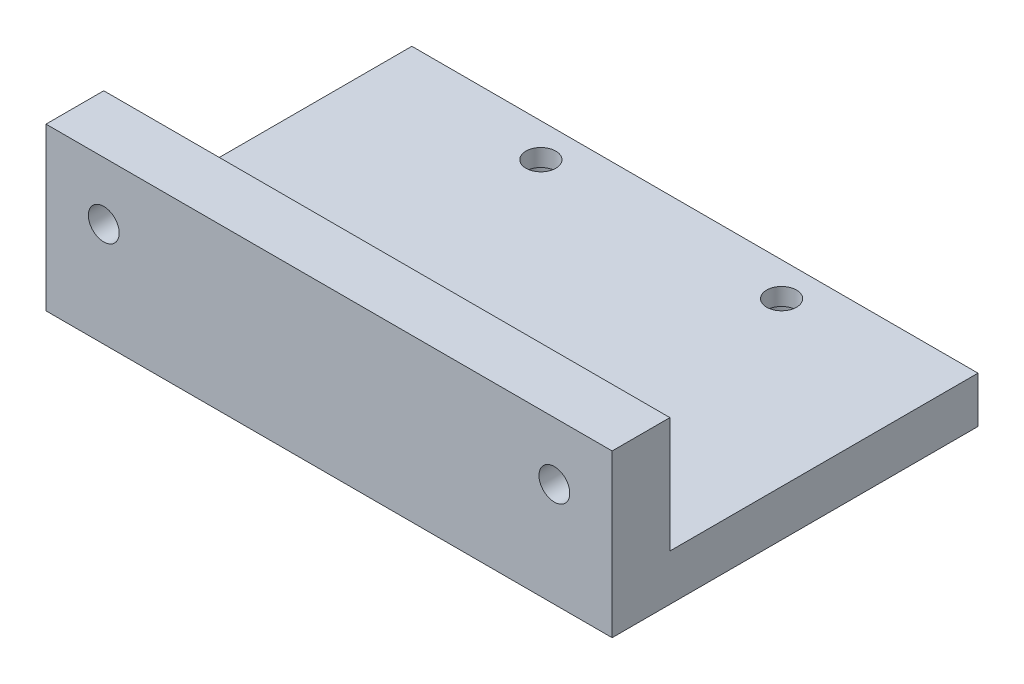
ISO-10303-21;
HEADER;
FILE_DESCRIPTION(('STEP AP214'),'2;1');
FILE_NAME('part.step','',(''),(''),'','','');
FILE_SCHEMA(('AUTOMOTIVE_DESIGN { 1 0 10303 214 1 1 1 1 }'));
ENDSEC;
DATA;
#1=APPLICATION_CONTEXT('core data for automotive mechanical design processes');
#2=APPLICATION_PROTOCOL_DEFINITION('international standard','automotive_design',2000,#1);
#3=PRODUCT_CONTEXT('',#1,'mechanical');
#4=PRODUCT('Part','Part','',(#3));
#5=PRODUCT_RELATED_PRODUCT_CATEGORY('part','',(#4));
#6=PRODUCT_DEFINITION_FORMATION('','',#4);
#7=PRODUCT_DEFINITION_CONTEXT('part definition',#1,'design');
#8=PRODUCT_DEFINITION('design','',#6,#7);
#9=PRODUCT_DEFINITION_SHAPE('','',#8);
#10=(LENGTH_UNIT() NAMED_UNIT(*) SI_UNIT(.MILLI.,.METRE.));
#11=(NAMED_UNIT(*) PLANE_ANGLE_UNIT() SI_UNIT($,.RADIAN.));
#12=(NAMED_UNIT(*) SI_UNIT($,.STERADIAN.) SOLID_ANGLE_UNIT());
#13=UNCERTAINTY_MEASURE_WITH_UNIT(LENGTH_MEASURE(1.E-05),#10,'distance_accuracy_value','');
#14=(GEOMETRIC_REPRESENTATION_CONTEXT(3) GLOBAL_UNCERTAINTY_ASSIGNED_CONTEXT((#13)) GLOBAL_UNIT_ASSIGNED_CONTEXT((#10,
#11,#12)) REPRESENTATION_CONTEXT('',''));
#15=CARTESIAN_POINT('',(0.,0.,0.));
#16=DIRECTION('',(0.,0.,1.));
#17=DIRECTION('',(1.,0.,0.));
#18=AXIS2_PLACEMENT_3D('',#15,#16,#17);
#19=CARTESIAN_POINT('',(-29.4,87.9053297089188,16.));
#20=DIRECTION('',(0.,0.,-1.));
#21=DIRECTION('',(-1.,0.,0.));
#22=AXIS2_PLACEMENT_3D('',#19,#20,#21);
#23=PLANE('',#22);
#24=DIRECTION('',(-0.500000000000001,0.866025403784438,0.));
#25=VECTOR('',#24,1.);
#26=CARTESIAN_POINT('',(21.783419246269,8.,16.));
#27=LINE('',#26,#25);
#28=CARTESIAN_POINT('',(21.783419246269,8.,16.));
#29=VERTEX_POINT('',#28);
#30=CARTESIAN_POINT('',(20.1668384925381,10.8,16.));
#31=VERTEX_POINT('',#30);
#32=EDGE_CURVE('E61',#29,#31,#27,.T.);
#33=ORIENTED_EDGE('',*,*,#32,.F.);
#34=DIRECTION('',(-1.,0.,0.));
#35=VECTOR('',#34,1.);
#36=CARTESIAN_POINT('',(25.0165807537309,8.,16.));
#37=LINE('',#36,#35);
#38=CARTESIAN_POINT('',(25.0165807537309,8.,16.));
#39=VERTEX_POINT('',#38);
#40=EDGE_CURVE('E230',#39,#29,#37,.T.);
#41=ORIENTED_EDGE('',*,*,#40,.F.);
#42=DIRECTION('',(-0.499999999999999,-0.866025403784439,0.));
#43=VECTOR('',#42,1.);
#44=CARTESIAN_POINT('',(26.6331615074619,10.8,16.));
#45=LINE('',#44,#43);
#46=CARTESIAN_POINT('',(26.6331615074619,10.8,16.));
#47=VERTEX_POINT('',#46);
#48=EDGE_CURVE('E256',#47,#39,#45,.T.);
#49=ORIENTED_EDGE('',*,*,#48,.F.);
#50=DIRECTION('',(0.5,-0.866025403784439,0.));
#51=VECTOR('',#50,1.);
#52=CARTESIAN_POINT('',(25.0165807537309,13.6,16.));
#53=LINE('',#52,#51);
#54=CARTESIAN_POINT('',(25.0165807537309,13.6,16.));
#55=VERTEX_POINT('',#54);
#56=EDGE_CURVE('E253',#55,#47,#53,.T.);
#57=ORIENTED_EDGE('',*,*,#56,.F.);
#58=DIRECTION('',(1.,0.,0.));
#59=VECTOR('',#58,1.);
#60=CARTESIAN_POINT('',(21.783419246269,13.6,16.));
#61=LINE('',#60,#59);
#62=CARTESIAN_POINT('',(21.783419246269,13.6,16.));
#63=VERTEX_POINT('',#62);
#64=EDGE_CURVE('E250',#63,#55,#61,.T.);
#65=ORIENTED_EDGE('',*,*,#64,.F.);
#66=DIRECTION('',(0.5,0.866025403784439,0.));
#67=VECTOR('',#66,1.);
#68=CARTESIAN_POINT('',(20.1668384925381,10.8,16.));
#69=LINE('',#68,#67);
#70=EDGE_CURVE('E247',#31,#63,#69,.T.);
#71=ORIENTED_EDGE('',*,*,#70,.F.);
#72=EDGE_LOOP('',(#33,#41,#49,#57,#65,#71));
#73=FACE_BOUND('',#72,.T.);
#74=DIRECTION('',(1.,0.,0.));
#75=VECTOR('',#74,1.);
#76=CARTESIAN_POINT('',(-29.4,4.8,16.));
#77=LINE('',#76,#75);
#78=CARTESIAN_POINT('',(-29.4,4.8,16.));
#79=VERTEX_POINT('',#78);
#80=CARTESIAN_POINT('',(29.4,4.8,16.));
#81=VERTEX_POINT('',#80);
#82=EDGE_CURVE('E341',#79,#81,#77,.T.);
#83=ORIENTED_EDGE('',*,*,#82,.F.);
#84=DIRECTION('',(0.,-1.,0.));
#85=VECTOR('',#84,1.);
#86=CARTESIAN_POINT('',(-29.4,87.9053297089188,16.));
#87=LINE('',#86,#85);
#88=CARTESIAN_POINT('',(-29.4,16.8,16.));
#89=VERTEX_POINT('',#88);
#90=EDGE_CURVE('E283',#89,#79,#87,.T.);
#91=ORIENTED_EDGE('',*,*,#90,.F.);
#92=DIRECTION('',(-1.,0.,0.));
#93=VECTOR('',#92,1.);
#94=CARTESIAN_POINT('',(-29.4,16.8,16.));
#95=LINE('',#94,#93);
#96=CARTESIAN_POINT('',(29.4,16.8,16.));
#97=VERTEX_POINT('',#96);
#98=EDGE_CURVE('E280',#97,#89,#95,.T.);
#99=ORIENTED_EDGE('',*,*,#98,.F.);
#100=DIRECTION('',(0.,-1.,0.));
#101=VECTOR('',#100,1.);
#102=CARTESIAN_POINT('',(29.4,87.9053297089188,16.));
#103=LINE('',#102,#101);
#104=EDGE_CURVE('E289',#97,#81,#103,.T.);
#105=ORIENTED_EDGE('',*,*,#104,.T.);
#106=EDGE_LOOP('',(#83,#91,#99,#105));
#107=FACE_BOUND('',#106,.T.);
#108=DIRECTION('',(1.,0.,0.));
#109=VECTOR('',#108,1.);
#110=CARTESIAN_POINT('',(-25.0165807537309,8.,16.));
#111=LINE('',#110,#109);
#112=CARTESIAN_POINT('',(-25.0165807537309,8.,16.));
#113=VERTEX_POINT('',#112);
#114=CARTESIAN_POINT('',(-21.783419246269,8.00000000000001,16.));
#115=VERTEX_POINT('',#114);
#116=EDGE_CURVE('E200',#113,#115,#111,.T.);
#117=ORIENTED_EDGE('',*,*,#116,.T.);
#118=DIRECTION('',(0.500000000000001,0.866025403784438,0.));
#119=VECTOR('',#118,1.);
#120=CARTESIAN_POINT('',(-21.783419246269,8.,16.));
#121=LINE('',#120,#119);
#122=CARTESIAN_POINT('',(-20.1668384925381,10.8,16.));
#123=VERTEX_POINT('',#122);
#124=EDGE_CURVE('E53',#115,#123,#121,.T.);
#125=ORIENTED_EDGE('',*,*,#124,.T.);
#126=DIRECTION('',(-0.5,0.866025403784439,0.));
#127=VECTOR('',#126,1.);
#128=CARTESIAN_POINT('',(-20.1668384925381,10.8,16.));
#129=LINE('',#128,#127);
#130=CARTESIAN_POINT('',(-21.783419246269,13.6,16.));
#131=VERTEX_POINT('',#130);
#132=EDGE_CURVE('E184',#123,#131,#129,.T.);
#133=ORIENTED_EDGE('',*,*,#132,.T.);
#134=DIRECTION('',(-1.,0.,0.));
#135=VECTOR('',#134,1.);
#136=CARTESIAN_POINT('',(-21.783419246269,13.6,16.));
#137=LINE('',#136,#135);
#138=CARTESIAN_POINT('',(-25.0165807537309,13.6,16.));
#139=VERTEX_POINT('',#138);
#140=EDGE_CURVE('E187',#131,#139,#137,.T.);
#141=ORIENTED_EDGE('',*,*,#140,.T.);
#142=DIRECTION('',(-0.5,-0.866025403784439,0.));
#143=VECTOR('',#142,1.);
#144=CARTESIAN_POINT('',(-25.0165807537309,13.6,16.));
#145=LINE('',#144,#143);
#146=CARTESIAN_POINT('',(-26.6331615074619,10.8,16.));
#147=VERTEX_POINT('',#146);
#148=EDGE_CURVE('E206',#139,#147,#145,.T.);
#149=ORIENTED_EDGE('',*,*,#148,.T.);
#150=DIRECTION('',(0.499999999999999,-0.866025403784439,0.));
#151=VECTOR('',#150,1.);
#152=CARTESIAN_POINT('',(-26.6331615074619,10.8,16.));
#153=LINE('',#152,#151);
#154=EDGE_CURVE('E203',#147,#113,#153,.T.);
#155=ORIENTED_EDGE('',*,*,#154,.T.);
#156=EDGE_LOOP('',(#117,#125,#133,#141,#149,#155));
#157=FACE_BOUND('',#156,.T.);
#158=ADVANCED_FACE('F36',(#73,#107,#157),#23,.T.);
#159=CARTESIAN_POINT('',(-12.5,4.8,-12.5));
#160=DIRECTION('',(0.,-1.,0.));
#161=DIRECTION('',(0.,0.,-1.));
#162=AXIS2_PLACEMENT_3D('',#159,#160,#161);
#163=CYLINDRICAL_SURFACE('',#162,1.55);
#164=CARTESIAN_POINT('',(-12.5,4.8,-12.5));
#165=DIRECTION('',(0.,1.,0.));
#166=DIRECTION('',(0.,0.,1.));
#167=AXIS2_PLACEMENT_3D('',#164,#165,#166);
#168=CIRCLE('',#167,1.55);
#169=CARTESIAN_POINT('',(-12.5,4.8,-10.95));
#170=VERTEX_POINT('',#169);
#171=EDGE_CURVE('E328',#170,#170,#168,.T.);
#172=ORIENTED_EDGE('',*,*,#171,.T.);
#173=EDGE_LOOP('',(#172));
#174=FACE_BOUND('',#173,.T.);
#175=CARTESIAN_POINT('',(-12.5,3.,-12.5));
#176=DIRECTION('',(0.,-1.,0.));
#177=DIRECTION('',(0.,0.,-1.));
#178=AXIS2_PLACEMENT_3D('',#175,#176,#177);
#179=CIRCLE('',#178,1.55);
#180=CARTESIAN_POINT('',(-12.5,3.,-14.05));
#181=VERTEX_POINT('',#180);
#182=EDGE_CURVE('E40',#181,#181,#179,.T.);
#183=ORIENTED_EDGE('',*,*,#182,.T.);
#184=EDGE_LOOP('',(#183));
#185=FACE_BOUND('',#184,.T.);
#186=ADVANCED_FACE('F362',(#174,#185),#163,.F.);
#187=CARTESIAN_POINT('',(12.5,4.8,-12.5));
#188=DIRECTION('',(0.,-1.,0.));
#189=DIRECTION('',(0.,0.,-1.));
#190=AXIS2_PLACEMENT_3D('',#187,#188,#189);
#191=CYLINDRICAL_SURFACE('',#190,1.55);
#192=CARTESIAN_POINT('',(12.5,4.8,-12.5));
#193=DIRECTION('',(0.,1.,0.));
#194=DIRECTION('',(0.,0.,1.));
#195=AXIS2_PLACEMENT_3D('',#192,#193,#194);
#196=CIRCLE('',#195,1.55);
#197=CARTESIAN_POINT('',(12.5,4.8,-10.95));
#198=VERTEX_POINT('',#197);
#199=EDGE_CURVE('E325',#198,#198,#196,.T.);
#200=ORIENTED_EDGE('',*,*,#199,.T.);
#201=EDGE_LOOP('',(#200));
#202=FACE_BOUND('',#201,.T.);
#203=CARTESIAN_POINT('',(12.5,3.,-12.5));
#204=DIRECTION('',(0.,-1.,0.));
#205=DIRECTION('',(0.,0.,-1.));
#206=AXIS2_PLACEMENT_3D('',#203,#204,#205);
#207=CIRCLE('',#206,1.55);
#208=CARTESIAN_POINT('',(12.5,3.,-14.05));
#209=VERTEX_POINT('',#208);
#210=EDGE_CURVE('E355',#209,#209,#207,.T.);
#211=ORIENTED_EDGE('',*,*,#210,.T.);
#212=EDGE_LOOP('',(#211));
#213=FACE_BOUND('',#212,.T.);
#214=ADVANCED_FACE('F432',(#202,#213),#191,.F.);
#215=CARTESIAN_POINT('',(12.5,4.8,12.5));
#216=DIRECTION('',(0.,-1.,0.));
#217=DIRECTION('',(0.,0.,-1.));
#218=AXIS2_PLACEMENT_3D('',#215,#216,#217);
#219=CYLINDRICAL_SURFACE('',#218,1.55);
#220=CARTESIAN_POINT('',(12.5,4.8,12.5));
#221=DIRECTION('',(0.,1.,0.));
#222=DIRECTION('',(0.,0.,1.));
#223=AXIS2_PLACEMENT_3D('',#220,#221,#222);
#224=CIRCLE('',#223,1.55);
#225=CARTESIAN_POINT('',(12.5,4.8,14.05));
#226=VERTEX_POINT('',#225);
#227=EDGE_CURVE('E322',#226,#226,#224,.T.);
#228=ORIENTED_EDGE('',*,*,#227,.T.);
#229=EDGE_LOOP('',(#228));
#230=FACE_BOUND('',#229,.T.);
#231=CARTESIAN_POINT('',(12.5,3.,12.5));
#232=DIRECTION('',(0.,-1.,0.));
#233=DIRECTION('',(0.,0.,-1.));
#234=AXIS2_PLACEMENT_3D('',#231,#232,#233);
#235=CIRCLE('',#234,1.55);
#236=CARTESIAN_POINT('',(12.5,3.,10.95));
#237=VERTEX_POINT('',#236);
#238=EDGE_CURVE('E353',#237,#237,#235,.T.);
#239=ORIENTED_EDGE('',*,*,#238,.T.);
#240=EDGE_LOOP('',(#239));
#241=FACE_BOUND('',#240,.T.);
#242=ADVANCED_FACE('F462',(#230,#241),#219,.F.);
#243=CARTESIAN_POINT('',(-12.5,4.8,12.5));
#244=DIRECTION('',(0.,-1.,0.));
#245=DIRECTION('',(0.,0.,-1.));
#246=AXIS2_PLACEMENT_3D('',#243,#244,#245);
#247=CYLINDRICAL_SURFACE('',#246,1.55);
#248=CARTESIAN_POINT('',(-12.5,4.8,12.5));
#249=DIRECTION('',(0.,1.,0.));
#250=DIRECTION('',(0.,0.,1.));
#251=AXIS2_PLACEMENT_3D('',#248,#249,#250);
#252=CIRCLE('',#251,1.55);
#253=CARTESIAN_POINT('',(-12.5,4.8,14.05));
#254=VERTEX_POINT('',#253);
#255=EDGE_CURVE('E319',#254,#254,#252,.T.);
#256=ORIENTED_EDGE('',*,*,#255,.T.);
#257=EDGE_LOOP('',(#256));
#258=FACE_BOUND('',#257,.T.);
#259=CARTESIAN_POINT('',(-12.5,3.,12.5));
#260=DIRECTION('',(0.,-1.,0.));
#261=DIRECTION('',(0.,0.,-1.));
#262=AXIS2_PLACEMENT_3D('',#259,#260,#261);
#263=CIRCLE('',#262,1.55);
#264=CARTESIAN_POINT('',(-12.5,3.,10.95));
#265=VERTEX_POINT('',#264);
#266=EDGE_CURVE('E316',#265,#265,#263,.T.);
#267=ORIENTED_EDGE('',*,*,#266,.T.);
#268=EDGE_LOOP('',(#267));
#269=FACE_BOUND('',#268,.T.);
#270=ADVANCED_FACE('F459',(#258,#269),#247,.F.);
#271=CARTESIAN_POINT('',(0.,4.8,0.));
#272=DIRECTION('',(0.,-1.,0.));
#273=DIRECTION('',(0.,0.,-1.));
#274=AXIS2_PLACEMENT_3D('',#271,#272,#273);
#275=PLANE('',#274);
#276=DIRECTION('',(0.,0.,-1.));
#277=VECTOR('',#276,1.);
#278=CARTESIAN_POINT('',(29.4,4.8,16.));
#279=LINE('',#278,#277);
#280=CARTESIAN_POINT('',(29.4,4.8,-16.));
#281=VERTEX_POINT('',#280);
#282=EDGE_CURVE('E332',#81,#281,#279,.T.);
#283=ORIENTED_EDGE('',*,*,#282,.T.);
#284=DIRECTION('',(-1.,0.,0.));
#285=VECTOR('',#284,1.);
#286=CARTESIAN_POINT('',(-29.4,4.8,-16.));
#287=LINE('',#286,#285);
#288=CARTESIAN_POINT('',(-29.4,4.8,-16.));
#289=VERTEX_POINT('',#288);
#290=EDGE_CURVE('E335',#281,#289,#287,.T.);
#291=ORIENTED_EDGE('',*,*,#290,.T.);
#292=DIRECTION('',(0.,0.,1.));
#293=VECTOR('',#292,1.);
#294=CARTESIAN_POINT('',(-29.4,4.8,16.));
#295=LINE('',#294,#293);
#296=EDGE_CURVE('E338',#289,#79,#295,.T.);
#297=ORIENTED_EDGE('',*,*,#296,.T.);
#298=ORIENTED_EDGE('',*,*,#82,.T.);
#299=EDGE_LOOP('',(#283,#291,#297,#298));
#300=FACE_BOUND('',#299,.T.);
#301=ORIENTED_EDGE('',*,*,#171,.F.);
#302=EDGE_LOOP('',(#301));
#303=FACE_BOUND('',#302,.T.);
#304=ORIENTED_EDGE('',*,*,#199,.F.);
#305=EDGE_LOOP('',(#304));
#306=FACE_BOUND('',#305,.T.);
#307=ORIENTED_EDGE('',*,*,#227,.F.);
#308=EDGE_LOOP('',(#307));
#309=FACE_BOUND('',#308,.T.);
#310=ORIENTED_EDGE('',*,*,#255,.F.);
#311=EDGE_LOOP('',(#310));
#312=FACE_BOUND('',#311,.T.);
#313=ADVANCED_FACE('F381',(#300,#303,#306,#309,#312),#275,.F.);
#314=CARTESIAN_POINT('',(0.,0.,0.));
#315=DIRECTION('',(0.,-1.,0.));
#316=DIRECTION('',(0.,0.,-1.));
#317=AXIS2_PLACEMENT_3D('',#314,#315,#316);
#318=PLANE('',#317);
#319=CARTESIAN_POINT('',(-12.5,0.,-12.5));
#320=DIRECTION('',(0.,-1.,0.));
#321=DIRECTION('',(0.,0.,-1.));
#322=AXIS2_PLACEMENT_3D('',#319,#320,#321);
#323=CIRCLE('',#322,3.);
#324=CARTESIAN_POINT('',(-12.5,0.,-15.5));
#325=VERTEX_POINT('',#324);
#326=EDGE_CURVE('E294',#325,#325,#323,.T.);
#327=ORIENTED_EDGE('',*,*,#326,.F.);
#328=EDGE_LOOP('',(#327));
#329=FACE_BOUND('',#328,.T.);
#330=CARTESIAN_POINT('',(12.5,0.,-12.5));
#331=DIRECTION('',(0.,-1.,0.));
#332=DIRECTION('',(0.,0.,-1.));
#333=AXIS2_PLACEMENT_3D('',#330,#331,#332);
#334=CIRCLE('',#333,3.);
#335=CARTESIAN_POINT('',(12.5,0.,-15.5));
#336=VERTEX_POINT('',#335);
#337=EDGE_CURVE('E305',#336,#336,#334,.T.);
#338=ORIENTED_EDGE('',*,*,#337,.F.);
#339=EDGE_LOOP('',(#338));
#340=FACE_BOUND('',#339,.T.);
#341=CARTESIAN_POINT('',(12.5,0.,12.5));
#342=DIRECTION('',(0.,-1.,0.));
#343=DIRECTION('',(0.,0.,-1.));
#344=AXIS2_PLACEMENT_3D('',#341,#342,#343);
#345=CIRCLE('',#344,3.);
#346=CARTESIAN_POINT('',(12.5,0.,9.5));
#347=VERTEX_POINT('',#346);
#348=EDGE_CURVE('E299',#347,#347,#345,.T.);
#349=ORIENTED_EDGE('',*,*,#348,.F.);
#350=EDGE_LOOP('',(#349));
#351=FACE_BOUND('',#350,.T.);
#352=CARTESIAN_POINT('',(-12.5,0.,12.5));
#353=DIRECTION('',(0.,-1.,0.));
#354=DIRECTION('',(0.,0.,-1.));
#355=AXIS2_PLACEMENT_3D('',#352,#353,#354);
#356=CIRCLE('',#355,3.);
#357=CARTESIAN_POINT('',(-12.5,0.,9.5));
#358=VERTEX_POINT('',#357);
#359=EDGE_CURVE('E298',#358,#358,#356,.T.);
#360=ORIENTED_EDGE('',*,*,#359,.F.);
#361=EDGE_LOOP('',(#360));
#362=FACE_BOUND('',#361,.T.);
#363=DIRECTION('',(0.,0.,-1.));
#364=VECTOR('',#363,1.);
#365=CARTESIAN_POINT('',(29.4,0.,16.));
#366=LINE('',#365,#364);
#367=CARTESIAN_POINT('',(29.4,0.,22.));
#368=VERTEX_POINT('',#367);
#369=CARTESIAN_POINT('',(29.4,0.,-16.));
#370=VERTEX_POINT('',#369);
#371=EDGE_CURVE('E331',#368,#370,#366,.T.);
#372=ORIENTED_EDGE('',*,*,#371,.F.);
#373=DIRECTION('',(-1.,0.,0.));
#374=VECTOR('',#373,1.);
#375=CARTESIAN_POINT('',(-29.4,0.,22.));
#376=LINE('',#375,#374);
#377=CARTESIAN_POINT('',(-29.4,0.,22.));
#378=VERTEX_POINT('',#377);
#379=EDGE_CURVE('E263',#368,#378,#376,.T.);
#380=ORIENTED_EDGE('',*,*,#379,.T.);
#381=DIRECTION('',(0.,0.,1.));
#382=VECTOR('',#381,1.);
#383=CARTESIAN_POINT('',(-29.4,0.,16.));
#384=LINE('',#383,#382);
#385=CARTESIAN_POINT('',(-29.4,0.,-16.));
#386=VERTEX_POINT('',#385);
#387=EDGE_CURVE('E336',#386,#378,#384,.T.);
#388=ORIENTED_EDGE('',*,*,#387,.F.);
#389=DIRECTION('',(-1.,0.,0.));
#390=VECTOR('',#389,1.);
#391=CARTESIAN_POINT('',(-29.4,0.,-16.));
#392=LINE('',#391,#390);
#393=EDGE_CURVE('E346',#370,#386,#392,.T.);
#394=ORIENTED_EDGE('',*,*,#393,.F.);
#395=EDGE_LOOP('',(#372,#380,#388,#394));
#396=FACE_BOUND('',#395,.T.);
#397=ADVANCED_FACE('F378',(#329,#340,#351,#362,#396),#318,.T.);
#398=CARTESIAN_POINT('',(29.4,4.8,16.));
#399=DIRECTION('',(-1.,0.,0.));
#400=DIRECTION('',(0.,0.,1.));
#401=AXIS2_PLACEMENT_3D('',#398,#399,#400);
#402=PLANE('',#401);
#403=ORIENTED_EDGE('',*,*,#371,.T.);
#404=DIRECTION('',(0.,-1.,0.));
#405=VECTOR('',#404,1.);
#406=CARTESIAN_POINT('',(29.4,4.8,-16.));
#407=LINE('',#406,#405);
#408=EDGE_CURVE('E12',#281,#370,#407,.T.);
#409=ORIENTED_EDGE('',*,*,#408,.F.);
#410=ORIENTED_EDGE('',*,*,#282,.F.);
#411=ORIENTED_EDGE('',*,*,#104,.F.);
#412=DIRECTION('',(0.,0.,-1.));
#413=VECTOR('',#412,1.);
#414=CARTESIAN_POINT('',(29.4,16.8,16.));
#415=LINE('',#414,#413);
#416=CARTESIAN_POINT('',(29.4,16.8,22.));
#417=VERTEX_POINT('',#416);
#418=EDGE_CURVE('E273',#417,#97,#415,.T.);
#419=ORIENTED_EDGE('',*,*,#418,.F.);
#420=DIRECTION('',(0.,-1.,0.));
#421=VECTOR('',#420,1.);
#422=CARTESIAN_POINT('',(29.4,87.9053297089188,22.));
#423=LINE('',#422,#421);
#424=EDGE_CURVE('E286',#417,#368,#423,.T.);
#425=ORIENTED_EDGE('',*,*,#424,.T.);
#426=EDGE_LOOP('',(#403,#409,#410,#411,#419,#425));
#427=FACE_BOUND('',#426,.T.);
#428=ADVANCED_FACE('F38',(#427),#402,.F.);
#429=CARTESIAN_POINT('',(-29.4,4.8,-16.));
#430=DIRECTION('',(0.,0.,1.));
#431=DIRECTION('',(1.,0.,0.));
#432=AXIS2_PLACEMENT_3D('',#429,#430,#431);
#433=PLANE('',#432);
#434=ORIENTED_EDGE('',*,*,#393,.T.);
#435=DIRECTION('',(0.,-1.,0.));
#436=VECTOR('',#435,1.);
#437=CARTESIAN_POINT('',(-29.4,4.8,-16.));
#438=LINE('',#437,#436);
#439=EDGE_CURVE('E45',#289,#386,#438,.T.);
#440=ORIENTED_EDGE('',*,*,#439,.F.);
#441=ORIENTED_EDGE('',*,*,#290,.F.);
#442=ORIENTED_EDGE('',*,*,#408,.T.);
#443=EDGE_LOOP('',(#434,#440,#441,#442));
#444=FACE_BOUND('',#443,.T.);
#445=ADVANCED_FACE('F406',(#444),#433,.F.);
#446=CARTESIAN_POINT('',(-29.4,4.8,16.));
#447=DIRECTION('',(1.,0.,0.));
#448=DIRECTION('',(0.,0.,-1.));
#449=AXIS2_PLACEMENT_3D('',#446,#447,#448);
#450=PLANE('',#449);
#451=ORIENTED_EDGE('',*,*,#387,.T.);
#452=DIRECTION('',(0.,-1.,0.));
#453=VECTOR('',#452,1.);
#454=CARTESIAN_POINT('',(-29.4,87.9053297089188,22.));
#455=LINE('',#454,#453);
#456=CARTESIAN_POINT('',(-29.4,16.8,22.));
#457=VERTEX_POINT('',#456);
#458=EDGE_CURVE('E276',#457,#378,#455,.T.);
#459=ORIENTED_EDGE('',*,*,#458,.F.);
#460=DIRECTION('',(0.,0.,1.));
#461=VECTOR('',#460,1.);
#462=CARTESIAN_POINT('',(-29.4,16.8,16.));
#463=LINE('',#462,#461);
#464=EDGE_CURVE('E278',#89,#457,#463,.T.);
#465=ORIENTED_EDGE('',*,*,#464,.F.);
#466=ORIENTED_EDGE('',*,*,#90,.T.);
#467=ORIENTED_EDGE('',*,*,#296,.F.);
#468=ORIENTED_EDGE('',*,*,#439,.T.);
#469=EDGE_LOOP('',(#451,#459,#465,#466,#467,#468));
#470=FACE_BOUND('',#469,.T.);
#471=ADVANCED_FACE('F401',(#470),#450,.F.);
#472=CARTESIAN_POINT('',(-12.5,3.,12.5));
#473=DIRECTION('',(0.,-1.,0.));
#474=DIRECTION('',(0.,0.,-1.));
#475=AXIS2_PLACEMENT_3D('',#472,#473,#474);
#476=CYLINDRICAL_SURFACE('',#475,3.);
#477=CARTESIAN_POINT('',(-12.5,3.,12.5));
#478=DIRECTION('',(0.,-1.,0.));
#479=DIRECTION('',(0.,0.,-1.));
#480=AXIS2_PLACEMENT_3D('',#477,#478,#479);
#481=CIRCLE('',#480,3.);
#482=CARTESIAN_POINT('',(-12.5,3.,9.5));
#483=VERTEX_POINT('',#482);
#484=EDGE_CURVE('E313',#483,#483,#481,.T.);
#485=ORIENTED_EDGE('',*,*,#484,.F.);
#486=EDGE_LOOP('',(#485));
#487=FACE_BOUND('',#486,.T.);
#488=ORIENTED_EDGE('',*,*,#359,.T.);
#489=EDGE_LOOP('',(#488));
#490=FACE_BOUND('',#489,.T.);
#491=ADVANCED_FACE('F454',(#487,#490),#476,.F.);
#492=CARTESIAN_POINT('',(-12.5,3.,12.5));
#493=DIRECTION('',(0.,-1.,0.));
#494=DIRECTION('',(0.,0.,-1.));
#495=AXIS2_PLACEMENT_3D('',#492,#493,#494);
#496=PLANE('',#495);
#497=ORIENTED_EDGE('',*,*,#266,.F.);
#498=EDGE_LOOP('',(#497));
#499=FACE_BOUND('',#498,.T.);
#500=ORIENTED_EDGE('',*,*,#484,.T.);
#501=EDGE_LOOP('',(#500));
#502=FACE_BOUND('',#501,.T.);
#503=ADVANCED_FACE('F444',(#499,#502),#496,.T.);
#504=CARTESIAN_POINT('',(12.5,3.,12.5));
#505=DIRECTION('',(0.,-1.,0.));
#506=DIRECTION('',(0.,0.,-1.));
#507=AXIS2_PLACEMENT_3D('',#504,#505,#506);
#508=CYLINDRICAL_SURFACE('',#507,3.);
#509=CARTESIAN_POINT('',(12.5,3.,12.5));
#510=DIRECTION('',(0.,-1.,0.));
#511=DIRECTION('',(0.,0.,-1.));
#512=AXIS2_PLACEMENT_3D('',#509,#510,#511);
#513=CIRCLE('',#512,3.);
#514=CARTESIAN_POINT('',(12.5,3.,9.5));
#515=VERTEX_POINT('',#514);
#516=EDGE_CURVE('E295',#515,#515,#513,.T.);
#517=ORIENTED_EDGE('',*,*,#516,.F.);
#518=EDGE_LOOP('',(#517));
#519=FACE_BOUND('',#518,.T.);
#520=ORIENTED_EDGE('',*,*,#348,.T.);
#521=EDGE_LOOP('',(#520));
#522=FACE_BOUND('',#521,.T.);
#523=ADVANCED_FACE('F440',(#519,#522),#508,.F.);
#524=CARTESIAN_POINT('',(12.5,3.,12.5));
#525=DIRECTION('',(0.,-1.,0.));
#526=DIRECTION('',(0.,0.,-1.));
#527=AXIS2_PLACEMENT_3D('',#524,#525,#526);
#528=PLANE('',#527);
#529=ORIENTED_EDGE('',*,*,#238,.F.);
#530=EDGE_LOOP('',(#529));
#531=FACE_BOUND('',#530,.T.);
#532=ORIENTED_EDGE('',*,*,#516,.T.);
#533=EDGE_LOOP('',(#532));
#534=FACE_BOUND('',#533,.T.);
#535=ADVANCED_FACE('F436',(#531,#534),#528,.T.);
#536=CARTESIAN_POINT('',(12.5,3.,-12.5));
#537=DIRECTION('',(0.,-1.,0.));
#538=DIRECTION('',(0.,0.,-1.));
#539=AXIS2_PLACEMENT_3D('',#536,#537,#538);
#540=CYLINDRICAL_SURFACE('',#539,3.);
#541=CARTESIAN_POINT('',(12.5,3.,-12.5));
#542=DIRECTION('',(0.,-1.,0.));
#543=DIRECTION('',(0.,0.,-1.));
#544=AXIS2_PLACEMENT_3D('',#541,#542,#543);
#545=CIRCLE('',#544,3.);
#546=CARTESIAN_POINT('',(12.5,3.,-15.5));
#547=VERTEX_POINT('',#546);
#548=EDGE_CURVE('E302',#547,#547,#545,.T.);
#549=ORIENTED_EDGE('',*,*,#548,.F.);
#550=EDGE_LOOP('',(#549));
#551=FACE_BOUND('',#550,.T.);
#552=ORIENTED_EDGE('',*,*,#337,.T.);
#553=EDGE_LOOP('',(#552));
#554=FACE_BOUND('',#553,.T.);
#555=ADVANCED_FACE('F439',(#551,#554),#540,.F.);
#556=CARTESIAN_POINT('',(12.5,3.,-12.5));
#557=DIRECTION('',(0.,-1.,0.));
#558=DIRECTION('',(0.,0.,-1.));
#559=AXIS2_PLACEMENT_3D('',#556,#557,#558);
#560=PLANE('',#559);
#561=ORIENTED_EDGE('',*,*,#210,.F.);
#562=EDGE_LOOP('',(#561));
#563=FACE_BOUND('',#562,.T.);
#564=ORIENTED_EDGE('',*,*,#548,.T.);
#565=EDGE_LOOP('',(#564));
#566=FACE_BOUND('',#565,.T.);
#567=ADVANCED_FACE('F374',(#563,#566),#560,.T.);
#568=CARTESIAN_POINT('',(-12.5,3.,-12.5));
#569=DIRECTION('',(0.,-1.,0.));
#570=DIRECTION('',(0.,0.,-1.));
#571=AXIS2_PLACEMENT_3D('',#568,#569,#570);
#572=CYLINDRICAL_SURFACE('',#571,3.);
#573=CARTESIAN_POINT('',(-12.5,3.,-12.5));
#574=DIRECTION('',(0.,-1.,0.));
#575=DIRECTION('',(0.,0.,-1.));
#576=AXIS2_PLACEMENT_3D('',#573,#574,#575);
#577=CIRCLE('',#576,3.);
#578=CARTESIAN_POINT('',(-12.5,3.,-15.5));
#579=VERTEX_POINT('',#578);
#580=EDGE_CURVE('E308',#579,#579,#577,.T.);
#581=ORIENTED_EDGE('',*,*,#580,.F.);
#582=EDGE_LOOP('',(#581));
#583=FACE_BOUND('',#582,.T.);
#584=ORIENTED_EDGE('',*,*,#326,.T.);
#585=EDGE_LOOP('',(#584));
#586=FACE_BOUND('',#585,.T.);
#587=ADVANCED_FACE('F368',(#583,#586),#572,.F.);
#588=CARTESIAN_POINT('',(-12.5,3.,-12.5));
#589=DIRECTION('',(0.,-1.,0.));
#590=DIRECTION('',(0.,0.,-1.));
#591=AXIS2_PLACEMENT_3D('',#588,#589,#590);
#592=PLANE('',#591);
#593=ORIENTED_EDGE('',*,*,#182,.F.);
#594=EDGE_LOOP('',(#593));
#595=FACE_BOUND('',#594,.T.);
#596=ORIENTED_EDGE('',*,*,#580,.T.);
#597=EDGE_LOOP('',(#596));
#598=FACE_BOUND('',#597,.T.);
#599=ADVANCED_FACE('F364',(#595,#598),#592,.T.);
#600=CARTESIAN_POINT('',(-29.4,87.9053297089188,22.));
#601=DIRECTION('',(0.,0.,1.));
#602=DIRECTION('',(1.,0.,0.));
#603=AXIS2_PLACEMENT_3D('',#600,#601,#602);
#604=PLANE('',#603);
#605=CARTESIAN_POINT('',(-23.4,10.8,22.));
#606=DIRECTION('',(0.,0.,1.));
#607=DIRECTION('',(1.,0.,0.));
#608=AXIS2_PLACEMENT_3D('',#605,#606,#607);
#609=CIRCLE('',#608,1.6);
#610=CARTESIAN_POINT('',(-21.8,10.8,22.));
#611=VERTEX_POINT('',#610);
#612=EDGE_CURVE('E201',#611,#611,#609,.T.);
#613=ORIENTED_EDGE('',*,*,#612,.F.);
#614=EDGE_LOOP('',(#613));
#615=FACE_BOUND('',#614,.T.);
#616=CARTESIAN_POINT('',(23.4,10.8,22.));
#617=DIRECTION('',(0.,0.,-1.));
#618=DIRECTION('',(-1.,0.,0.));
#619=AXIS2_PLACEMENT_3D('',#616,#617,#618);
#620=CIRCLE('',#619,1.6);
#621=CARTESIAN_POINT('',(21.8,10.8,22.));
#622=VERTEX_POINT('',#621);
#623=EDGE_CURVE('E221',#622,#622,#620,.T.);
#624=ORIENTED_EDGE('',*,*,#623,.T.);
#625=EDGE_LOOP('',(#624));
#626=FACE_BOUND('',#625,.T.);
#627=DIRECTION('',(1.,0.,0.));
#628=VECTOR('',#627,1.);
#629=CARTESIAN_POINT('',(-29.4,16.8,22.));
#630=LINE('',#629,#628);
#631=EDGE_CURVE('E275',#457,#417,#630,.T.);
#632=ORIENTED_EDGE('',*,*,#631,.F.);
#633=ORIENTED_EDGE('',*,*,#458,.T.);
#634=ORIENTED_EDGE('',*,*,#379,.F.);
#635=ORIENTED_EDGE('',*,*,#424,.F.);
#636=EDGE_LOOP('',(#632,#633,#634,#635));
#637=FACE_BOUND('',#636,.T.);
#638=ADVANCED_FACE('F367',(#615,#626,#637),#604,.T.);
#639=CARTESIAN_POINT('',(0.,16.8,0.));
#640=DIRECTION('',(0.,-1.,0.));
#641=DIRECTION('',(0.,0.,-1.));
#642=AXIS2_PLACEMENT_3D('',#639,#640,#641);
#643=PLANE('',#642);
#644=ORIENTED_EDGE('',*,*,#464,.T.);
#645=ORIENTED_EDGE('',*,*,#631,.T.);
#646=ORIENTED_EDGE('',*,*,#418,.T.);
#647=ORIENTED_EDGE('',*,*,#98,.T.);
#648=EDGE_LOOP('',(#644,#645,#646,#647));
#649=FACE_BOUND('',#648,.T.);
#650=ADVANCED_FACE('F414',(#649),#643,.F.);
#651=CARTESIAN_POINT('',(21.783419246269,8.,19.));
#652=DIRECTION('',(-0.866025403784438,-0.500000000000001,0.));
#653=DIRECTION('',(0.500000000000001,-0.866025403784438,0.));
#654=AXIS2_PLACEMENT_3D('',#651,#652,#653);
#655=PLANE('',#654);
#656=ORIENTED_EDGE('',*,*,#32,.T.);
#657=DIRECTION('',(0.,0.,-1.));
#658=VECTOR('',#657,1.);
#659=CARTESIAN_POINT('',(20.1668384925381,10.8,19.));
#660=LINE('',#659,#658);
#661=CARTESIAN_POINT('',(20.1668384925381,10.8,19.));
#662=VERTEX_POINT('',#661);
#663=EDGE_CURVE('E245',#662,#31,#660,.T.);
#664=ORIENTED_EDGE('',*,*,#663,.F.);
#665=DIRECTION('',(-0.500000000000001,0.866025403784438,0.));
#666=VECTOR('',#665,1.);
#667=CARTESIAN_POINT('',(21.783419246269,8.,19.));
#668=LINE('',#667,#666);
#669=CARTESIAN_POINT('',(21.783419246269,8.,19.));
#670=VERTEX_POINT('',#669);
#671=EDGE_CURVE('E226',#670,#662,#668,.T.);
#672=ORIENTED_EDGE('',*,*,#671,.F.);
#673=DIRECTION('',(0.,0.,-1.));
#674=VECTOR('',#673,1.);
#675=CARTESIAN_POINT('',(21.783419246269,8.,19.));
#676=LINE('',#675,#674);
#677=EDGE_CURVE('E261',#670,#29,#676,.T.);
#678=ORIENTED_EDGE('',*,*,#677,.T.);
#679=EDGE_LOOP('',(#656,#664,#672,#678));
#680=FACE_BOUND('',#679,.T.);
#681=ADVANCED_FACE('F416',(#680),#655,.F.);
#682=CARTESIAN_POINT('',(25.0165807537309,8.,19.));
#683=DIRECTION('',(0.,-1.,0.));
#684=DIRECTION('',(0.,0.,-1.));
#685=AXIS2_PLACEMENT_3D('',#682,#683,#684);
#686=PLANE('',#685);
#687=ORIENTED_EDGE('',*,*,#40,.T.);
#688=ORIENTED_EDGE('',*,*,#677,.F.);
#689=DIRECTION('',(-1.,0.,0.));
#690=VECTOR('',#689,1.);
#691=CARTESIAN_POINT('',(25.0165807537309,8.,19.));
#692=LINE('',#691,#690);
#693=CARTESIAN_POINT('',(25.0165807537309,8.,19.));
#694=VERTEX_POINT('',#693);
#695=EDGE_CURVE('E242',#694,#670,#692,.T.);
#696=ORIENTED_EDGE('',*,*,#695,.F.);
#697=DIRECTION('',(0.,0.,-1.));
#698=VECTOR('',#697,1.);
#699=CARTESIAN_POINT('',(25.0165807537309,8.,19.));
#700=LINE('',#699,#698);
#701=EDGE_CURVE('E264',#694,#39,#700,.T.);
#702=ORIENTED_EDGE('',*,*,#701,.T.);
#703=EDGE_LOOP('',(#687,#688,#696,#702));
#704=FACE_BOUND('',#703,.T.);
#705=ADVANCED_FACE('F422',(#704),#686,.F.);
#706=CARTESIAN_POINT('',(26.6331615074619,10.8,19.));
#707=DIRECTION('',(0.866025403784439,-0.499999999999999,0.));
#708=DIRECTION('',(0.499999999999999,0.866025403784439,0.));
#709=AXIS2_PLACEMENT_3D('',#706,#707,#708);
#710=PLANE('',#709);
#711=ORIENTED_EDGE('',*,*,#48,.T.);
#712=ORIENTED_EDGE('',*,*,#701,.F.);
#713=DIRECTION('',(-0.499999999999999,-0.866025403784439,0.));
#714=VECTOR('',#713,1.);
#715=CARTESIAN_POINT('',(26.6331615074619,10.8,19.));
#716=LINE('',#715,#714);
#717=CARTESIAN_POINT('',(26.6331615074619,10.8,19.));
#718=VERTEX_POINT('',#717);
#719=EDGE_CURVE('E239',#718,#694,#716,.T.);
#720=ORIENTED_EDGE('',*,*,#719,.F.);
#721=DIRECTION('',(0.,0.,-1.));
#722=VECTOR('',#721,1.);
#723=CARTESIAN_POINT('',(26.6331615074619,10.8,19.));
#724=LINE('',#723,#722);
#725=EDGE_CURVE('E266',#718,#47,#724,.T.);
#726=ORIENTED_EDGE('',*,*,#725,.T.);
#727=EDGE_LOOP('',(#711,#712,#720,#726));
#728=FACE_BOUND('',#727,.T.);
#729=ADVANCED_FACE('F555',(#728),#710,.F.);
#730=CARTESIAN_POINT('',(25.0165807537309,13.6,19.));
#731=DIRECTION('',(0.866025403784439,0.5,0.));
#732=DIRECTION('',(-0.5,0.866025403784439,0.));
#733=AXIS2_PLACEMENT_3D('',#730,#731,#732);
#734=PLANE('',#733);
#735=ORIENTED_EDGE('',*,*,#56,.T.);
#736=ORIENTED_EDGE('',*,*,#725,.F.);
#737=DIRECTION('',(0.5,-0.866025403784439,0.));
#738=VECTOR('',#737,1.);
#739=CARTESIAN_POINT('',(25.0165807537309,13.6,19.));
#740=LINE('',#739,#738);
#741=CARTESIAN_POINT('',(25.0165807537309,13.6,19.));
#742=VERTEX_POINT('',#741);
#743=EDGE_CURVE('E236',#742,#718,#740,.T.);
#744=ORIENTED_EDGE('',*,*,#743,.F.);
#745=DIRECTION('',(0.,0.,-1.));
#746=VECTOR('',#745,1.);
#747=CARTESIAN_POINT('',(25.0165807537309,13.6,19.));
#748=LINE('',#747,#746);
#749=EDGE_CURVE('E268',#742,#55,#748,.T.);
#750=ORIENTED_EDGE('',*,*,#749,.T.);
#751=EDGE_LOOP('',(#735,#736,#744,#750));
#752=FACE_BOUND('',#751,.T.);
#753=ADVANCED_FACE('F564',(#752),#734,.F.);
#754=CARTESIAN_POINT('',(21.783419246269,13.6,19.));
#755=DIRECTION('',(0.,1.,0.));
#756=DIRECTION('',(0.,0.,1.));
#757=AXIS2_PLACEMENT_3D('',#754,#755,#756);
#758=PLANE('',#757);
#759=ORIENTED_EDGE('',*,*,#64,.T.);
#760=ORIENTED_EDGE('',*,*,#749,.F.);
#761=DIRECTION('',(1.,0.,0.));
#762=VECTOR('',#761,1.);
#763=CARTESIAN_POINT('',(21.783419246269,13.6,19.));
#764=LINE('',#763,#762);
#765=CARTESIAN_POINT('',(21.783419246269,13.6,19.));
#766=VERTEX_POINT('',#765);
#767=EDGE_CURVE('E233',#766,#742,#764,.T.);
#768=ORIENTED_EDGE('',*,*,#767,.F.);
#769=DIRECTION('',(0.,0.,-1.));
#770=VECTOR('',#769,1.);
#771=CARTESIAN_POINT('',(21.783419246269,13.6,19.));
#772=LINE('',#771,#770);
#773=EDGE_CURVE('E270',#766,#63,#772,.T.);
#774=ORIENTED_EDGE('',*,*,#773,.T.);
#775=EDGE_LOOP('',(#759,#760,#768,#774));
#776=FACE_BOUND('',#775,.T.);
#777=ADVANCED_FACE('F573',(#776),#758,.F.);
#778=CARTESIAN_POINT('',(20.1668384925381,10.8,19.));
#779=DIRECTION('',(-0.866025403784439,0.5,0.));
#780=DIRECTION('',(-0.5,-0.866025403784439,0.));
#781=AXIS2_PLACEMENT_3D('',#778,#779,#780);
#782=PLANE('',#781);
#783=ORIENTED_EDGE('',*,*,#70,.T.);
#784=ORIENTED_EDGE('',*,*,#773,.F.);
#785=DIRECTION('',(0.5,0.866025403784439,0.));
#786=VECTOR('',#785,1.);
#787=CARTESIAN_POINT('',(20.1668384925381,10.8,19.));
#788=LINE('',#787,#786);
#789=EDGE_CURVE('E229',#662,#766,#788,.T.);
#790=ORIENTED_EDGE('',*,*,#789,.F.);
#791=ORIENTED_EDGE('',*,*,#663,.T.);
#792=EDGE_LOOP('',(#783,#784,#790,#791));
#793=FACE_BOUND('',#792,.T.);
#794=ADVANCED_FACE('F582',(#793),#782,.F.);
#795=CARTESIAN_POINT('',(0.,0.,19.));
#796=DIRECTION('',(0.,0.,-1.));
#797=DIRECTION('',(-1.,0.,0.));
#798=AXIS2_PLACEMENT_3D('',#795,#796,#797);
#799=PLANE('',#798);
#800=CARTESIAN_POINT('',(23.4,10.8,19.));
#801=DIRECTION('',(0.,0.,-1.));
#802=DIRECTION('',(-1.,0.,0.));
#803=AXIS2_PLACEMENT_3D('',#800,#801,#802);
#804=CIRCLE('',#803,1.6);
#805=CARTESIAN_POINT('',(21.8,10.8,19.));
#806=VERTEX_POINT('',#805);
#807=EDGE_CURVE('E213',#806,#806,#804,.T.);
#808=ORIENTED_EDGE('',*,*,#807,.F.);
#809=EDGE_LOOP('',(#808));
#810=FACE_BOUND('',#809,.T.);
#811=ORIENTED_EDGE('',*,*,#671,.T.);
#812=ORIENTED_EDGE('',*,*,#789,.T.);
#813=ORIENTED_EDGE('',*,*,#767,.T.);
#814=ORIENTED_EDGE('',*,*,#743,.T.);
#815=ORIENTED_EDGE('',*,*,#719,.T.);
#816=ORIENTED_EDGE('',*,*,#695,.T.);
#817=EDGE_LOOP('',(#811,#812,#813,#814,#815,#816));
#818=FACE_BOUND('',#817,.T.);
#819=ADVANCED_FACE('F591',(#810,#818),#799,.T.);
#820=CARTESIAN_POINT('',(23.4,10.8,22.));
#821=DIRECTION('',(0.,0.,-1.));
#822=DIRECTION('',(-1.,0.,0.));
#823=AXIS2_PLACEMENT_3D('',#820,#821,#822);
#824=CYLINDRICAL_SURFACE('',#823,1.6);
#825=ORIENTED_EDGE('',*,*,#623,.F.);
#826=EDGE_LOOP('',(#825));
#827=FACE_BOUND('',#826,.T.);
#828=ORIENTED_EDGE('',*,*,#807,.T.);
#829=EDGE_LOOP('',(#828));
#830=FACE_BOUND('',#829,.T.);
#831=ADVANCED_FACE('F600',(#827,#830),#824,.F.);
#832=CARTESIAN_POINT('',(-21.783419246269,8.,19.));
#833=DIRECTION('',(-0.866025403784438,0.500000000000001,0.));
#834=DIRECTION('',(-0.500000000000001,-0.866025403784438,0.));
#835=AXIS2_PLACEMENT_3D('',#832,#833,#834);
#836=PLANE('',#835);
#837=ORIENTED_EDGE('',*,*,#124,.F.);
#838=DIRECTION('',(0.,0.,-1.));
#839=VECTOR('',#838,1.);
#840=CARTESIAN_POINT('',(-21.783419246269,8.,19.));
#841=LINE('',#840,#839);
#842=CARTESIAN_POINT('',(-21.783419246269,8.,19.));
#843=VERTEX_POINT('',#842);
#844=EDGE_CURVE('E168',#843,#115,#841,.T.);
#845=ORIENTED_EDGE('',*,*,#844,.F.);
#846=DIRECTION('',(0.500000000000001,0.866025403784438,0.));
#847=VECTOR('',#846,1.);
#848=CARTESIAN_POINT('',(-21.783419246269,8.,19.));
#849=LINE('',#848,#847);
#850=CARTESIAN_POINT('',(-20.1668384925381,10.8,19.));
#851=VERTEX_POINT('',#850);
#852=EDGE_CURVE('E175',#843,#851,#849,.T.);
#853=ORIENTED_EDGE('',*,*,#852,.T.);
#854=DIRECTION('',(0.,0.,-1.));
#855=VECTOR('',#854,1.);
#856=CARTESIAN_POINT('',(-20.1668384925381,10.8,19.));
#857=LINE('',#856,#855);
#858=EDGE_CURVE('E211',#851,#123,#857,.T.);
#859=ORIENTED_EDGE('',*,*,#858,.T.);
#860=EDGE_LOOP('',(#837,#845,#853,#859));
#861=FACE_BOUND('',#860,.T.);
#862=ADVANCED_FACE('F178',(#861),#836,.T.);
#863=CARTESIAN_POINT('',(-20.1668384925381,10.8,19.));
#864=DIRECTION('',(-0.866025403784439,-0.5,0.));
#865=DIRECTION('',(0.5,-0.866025403784439,0.));
#866=AXIS2_PLACEMENT_3D('',#863,#864,#865);
#867=PLANE('',#866);
#868=ORIENTED_EDGE('',*,*,#132,.F.);
#869=ORIENTED_EDGE('',*,*,#858,.F.);
#870=DIRECTION('',(-0.5,0.866025403784439,0.));
#871=VECTOR('',#870,1.);
#872=CARTESIAN_POINT('',(-20.1668384925381,10.8,19.));
#873=LINE('',#872,#871);
#874=CARTESIAN_POINT('',(-21.783419246269,13.6,19.));
#875=VERTEX_POINT('',#874);
#876=EDGE_CURVE('E180',#851,#875,#873,.T.);
#877=ORIENTED_EDGE('',*,*,#876,.T.);
#878=DIRECTION('',(0.,0.,-1.));
#879=VECTOR('',#878,1.);
#880=CARTESIAN_POINT('',(-21.783419246269,13.6,19.));
#881=LINE('',#880,#879);
#882=EDGE_CURVE('E214',#875,#131,#881,.T.);
#883=ORIENTED_EDGE('',*,*,#882,.T.);
#884=EDGE_LOOP('',(#868,#869,#877,#883));
#885=FACE_BOUND('',#884,.T.);
#886=ADVANCED_FACE('F620',(#885),#867,.T.);
#887=CARTESIAN_POINT('',(-21.783419246269,13.6,19.));
#888=DIRECTION('',(0.,-1.,0.));
#889=DIRECTION('',(0.,0.,-1.));
#890=AXIS2_PLACEMENT_3D('',#887,#888,#889);
#891=PLANE('',#890);
#892=ORIENTED_EDGE('',*,*,#140,.F.);
#893=ORIENTED_EDGE('',*,*,#882,.F.);
#894=DIRECTION('',(-1.,0.,0.));
#895=VECTOR('',#894,1.);
#896=CARTESIAN_POINT('',(-21.783419246269,13.6,19.));
#897=LINE('',#896,#895);
#898=CARTESIAN_POINT('',(-25.0165807537309,13.6,19.));
#899=VERTEX_POINT('',#898);
#900=EDGE_CURVE('E196',#875,#899,#897,.T.);
#901=ORIENTED_EDGE('',*,*,#900,.T.);
#902=DIRECTION('',(0.,0.,-1.));
#903=VECTOR('',#902,1.);
#904=CARTESIAN_POINT('',(-25.0165807537309,13.6,19.));
#905=LINE('',#904,#903);
#906=EDGE_CURVE('E216',#899,#139,#905,.T.);
#907=ORIENTED_EDGE('',*,*,#906,.T.);
#908=EDGE_LOOP('',(#892,#893,#901,#907));
#909=FACE_BOUND('',#908,.T.);
#910=ADVANCED_FACE('F628',(#909),#891,.T.);
#911=CARTESIAN_POINT('',(-25.0165807537309,13.6,19.));
#912=DIRECTION('',(0.866025403784439,-0.5,0.));
#913=DIRECTION('',(0.5,0.866025403784439,0.));
#914=AXIS2_PLACEMENT_3D('',#911,#912,#913);
#915=PLANE('',#914);
#916=ORIENTED_EDGE('',*,*,#148,.F.);
#917=ORIENTED_EDGE('',*,*,#906,.F.);
#918=DIRECTION('',(-0.5,-0.866025403784439,0.));
#919=VECTOR('',#918,1.);
#920=CARTESIAN_POINT('',(-25.0165807537309,13.6,19.));
#921=LINE('',#920,#919);
#922=CARTESIAN_POINT('',(-26.6331615074619,10.8,19.));
#923=VERTEX_POINT('',#922);
#924=EDGE_CURVE('E194',#899,#923,#921,.T.);
#925=ORIENTED_EDGE('',*,*,#924,.T.);
#926=DIRECTION('',(0.,0.,-1.));
#927=VECTOR('',#926,1.);
#928=CARTESIAN_POINT('',(-26.6331615074619,10.8,19.));
#929=LINE('',#928,#927);
#930=EDGE_CURVE('E218',#923,#147,#929,.T.);
#931=ORIENTED_EDGE('',*,*,#930,.T.);
#932=EDGE_LOOP('',(#916,#917,#925,#931));
#933=FACE_BOUND('',#932,.T.);
#934=ADVANCED_FACE('F637',(#933),#915,.T.);
#935=CARTESIAN_POINT('',(-26.6331615074619,10.8,19.));
#936=DIRECTION('',(0.866025403784439,0.499999999999999,0.));
#937=DIRECTION('',(-0.499999999999999,0.866025403784439,0.));
#938=AXIS2_PLACEMENT_3D('',#935,#936,#937);
#939=PLANE('',#938);
#940=ORIENTED_EDGE('',*,*,#154,.F.);
#941=ORIENTED_EDGE('',*,*,#930,.F.);
#942=DIRECTION('',(0.499999999999999,-0.866025403784439,0.));
#943=VECTOR('',#942,1.);
#944=CARTESIAN_POINT('',(-26.6331615074619,10.8,19.));
#945=LINE('',#944,#943);
#946=CARTESIAN_POINT('',(-25.0165807537309,8.,19.));
#947=VERTEX_POINT('',#946);
#948=EDGE_CURVE('E174',#923,#947,#945,.T.);
#949=ORIENTED_EDGE('',*,*,#948,.T.);
#950=DIRECTION('',(0.,0.,-1.));
#951=VECTOR('',#950,1.);
#952=CARTESIAN_POINT('',(-25.0165807537309,8.,19.));
#953=LINE('',#952,#951);
#954=EDGE_CURVE('E170',#947,#113,#953,.T.);
#955=ORIENTED_EDGE('',*,*,#954,.T.);
#956=EDGE_LOOP('',(#940,#941,#949,#955));
#957=FACE_BOUND('',#956,.T.);
#958=ADVANCED_FACE('F646',(#957),#939,.T.);
#959=CARTESIAN_POINT('',(-25.0165807537309,8.,19.));
#960=DIRECTION('',(0.,1.,0.));
#961=DIRECTION('',(0.,0.,1.));
#962=AXIS2_PLACEMENT_3D('',#959,#960,#961);
#963=PLANE('',#962);
#964=ORIENTED_EDGE('',*,*,#116,.F.);
#965=ORIENTED_EDGE('',*,*,#954,.F.);
#966=DIRECTION('',(1.,0.,0.));
#967=VECTOR('',#966,1.);
#968=CARTESIAN_POINT('',(-25.0165807537309,8.,19.));
#969=LINE('',#968,#967);
#970=EDGE_CURVE('E165',#947,#843,#969,.T.);
#971=ORIENTED_EDGE('',*,*,#970,.T.);
#972=ORIENTED_EDGE('',*,*,#844,.T.);
#973=EDGE_LOOP('',(#964,#965,#971,#972));
#974=FACE_BOUND('',#973,.T.);
#975=ADVANCED_FACE('F167',(#974),#963,.T.);
#976=CARTESIAN_POINT('',(0.,0.,19.));
#977=DIRECTION('',(0.,0.,-1.));
#978=DIRECTION('',(1.,0.,0.));
#979=AXIS2_PLACEMENT_3D('',#976,#977,#978);
#980=PLANE('',#979);
#981=CARTESIAN_POINT('',(-23.4,10.8,19.));
#982=DIRECTION('',(0.,0.,1.));
#983=DIRECTION('',(1.,0.,0.));
#984=AXIS2_PLACEMENT_3D('',#981,#982,#983);
#985=CIRCLE('',#984,1.6);
#986=CARTESIAN_POINT('',(-21.8,10.8,19.));
#987=VERTEX_POINT('',#986);
#988=EDGE_CURVE('E190',#987,#987,#985,.T.);
#989=ORIENTED_EDGE('',*,*,#988,.T.);
#990=EDGE_LOOP('',(#989));
#991=FACE_BOUND('',#990,.T.);
#992=ORIENTED_EDGE('',*,*,#852,.F.);
#993=ORIENTED_EDGE('',*,*,#970,.F.);
#994=ORIENTED_EDGE('',*,*,#948,.F.);
#995=ORIENTED_EDGE('',*,*,#924,.F.);
#996=ORIENTED_EDGE('',*,*,#900,.F.);
#997=ORIENTED_EDGE('',*,*,#876,.F.);
#998=EDGE_LOOP('',(#992,#993,#994,#995,#996,#997));
#999=FACE_BOUND('',#998,.T.);
#1000=ADVANCED_FACE('F182',(#991,#999),#980,.T.);
#1001=CARTESIAN_POINT('',(-23.4,10.8,22.));
#1002=DIRECTION('',(0.,0.,-1.));
#1003=DIRECTION('',(-1.,0.,0.));
#1004=AXIS2_PLACEMENT_3D('',#1001,#1002,#1003);
#1005=CYLINDRICAL_SURFACE('',#1004,1.6);
#1006=ORIENTED_EDGE('',*,*,#612,.T.);
#1007=EDGE_LOOP('',(#1006));
#1008=FACE_BOUND('',#1007,.T.);
#1009=ORIENTED_EDGE('',*,*,#988,.F.);
#1010=EDGE_LOOP('',(#1009));
#1011=FACE_BOUND('',#1010,.T.);
#1012=ADVANCED_FACE('F670',(#1008,#1011),#1005,.F.);
#1013=CLOSED_SHELL('',(#158,#186,#214,#242,#270,#313,#397,#428,#445,#471,#491,#503,#523,#535,
#555,#567,#587,#599,#638,#650,#681,#705,#729,#753,#777,#794,#819,#831,#862,#886,#910,#934,#958,
#975,#1000,#1012));
#1014=MANIFOLD_SOLID_BREP('B2',#1013);
#1015=ADVANCED_BREP_SHAPE_REPRESENTATION('',(#18,#1014),#14);
#1016=SHAPE_DEFINITION_REPRESENTATION(#9,#1015);
ENDSEC;
END-ISO-10303-21;
